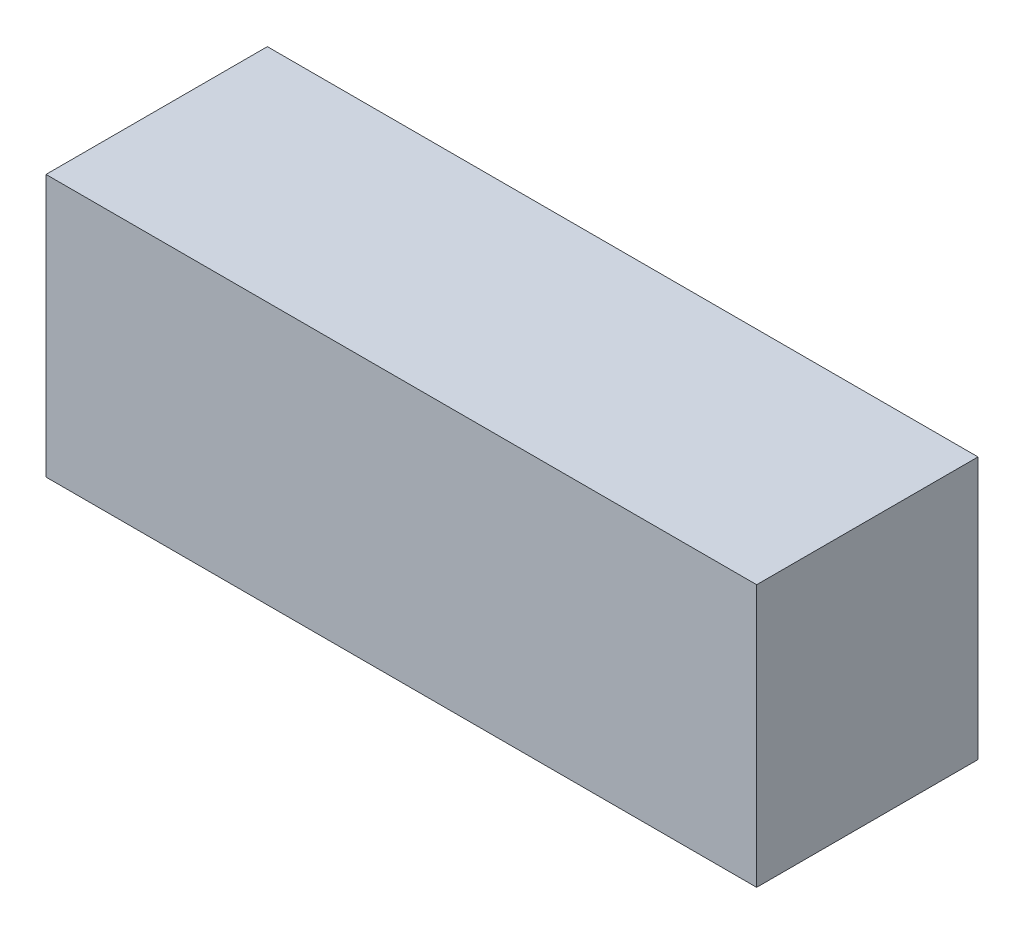
ISO-10303-21;
HEADER;
FILE_DESCRIPTION(('STEP AP214'),'2;1');
FILE_NAME('part.step','',(''),(''),'','','');
FILE_SCHEMA(('AUTOMOTIVE_DESIGN { 1 0 10303 214 1 1 1 1 }'));
ENDSEC;
DATA;
#1=APPLICATION_CONTEXT('core data for automotive mechanical design processes');
#2=APPLICATION_PROTOCOL_DEFINITION('international standard','automotive_design',2000,#1);
#3=PRODUCT_CONTEXT('',#1,'mechanical');
#4=PRODUCT('Part','Part','',(#3));
#5=PRODUCT_RELATED_PRODUCT_CATEGORY('part','',(#4));
#6=PRODUCT_DEFINITION_FORMATION('','',#4);
#7=PRODUCT_DEFINITION_CONTEXT('part definition',#1,'design');
#8=PRODUCT_DEFINITION('design','',#6,#7);
#9=PRODUCT_DEFINITION_SHAPE('','',#8);
#10=(LENGTH_UNIT() NAMED_UNIT(*) SI_UNIT(.MILLI.,.METRE.));
#11=(NAMED_UNIT(*) PLANE_ANGLE_UNIT() SI_UNIT($,.RADIAN.));
#12=(NAMED_UNIT(*) SI_UNIT($,.STERADIAN.) SOLID_ANGLE_UNIT());
#13=UNCERTAINTY_MEASURE_WITH_UNIT(LENGTH_MEASURE(1.E-05),#10,'distance_accuracy_value','');
#14=(GEOMETRIC_REPRESENTATION_CONTEXT(3) GLOBAL_UNCERTAINTY_ASSIGNED_CONTEXT((#13)) GLOBAL_UNIT_ASSIGNED_CONTEXT((#10,
#11,#12)) REPRESENTATION_CONTEXT('',''));
#15=CARTESIAN_POINT('',(0.,0.,0.));
#16=DIRECTION('',(0.,0.,1.));
#17=DIRECTION('',(1.,0.,0.));
#18=AXIS2_PLACEMENT_3D('',#15,#16,#17);
#19=CARTESIAN_POINT('',(-12.7,4.5,-3.8));
#20=DIRECTION('',(1.,0.,0.));
#21=DIRECTION('',(0.,0.,-1.));
#22=AXIS2_PLACEMENT_3D('',#19,#20,#21);
#23=PLANE('',#22);
#24=DIRECTION('',(0.,0.,1.));
#25=VECTOR('',#24,1.);
#26=CARTESIAN_POINT('',(-12.7,0.,-3.8));
#27=LINE('',#26,#25);
#28=CARTESIAN_POINT('',(-12.7,0.,-3.8));
#29=VERTEX_POINT('',#28);
#30=CARTESIAN_POINT('',(-12.7,0.,0.));
#31=VERTEX_POINT('',#30);
#32=EDGE_CURVE('E96',#29,#31,#27,.T.);
#33=ORIENTED_EDGE('',*,*,#32,.T.);
#34=DIRECTION('',(0.,-1.,0.));
#35=VECTOR('',#34,1.);
#36=CARTESIAN_POINT('',(-12.7,4.5,0.));
#37=LINE('',#36,#35);
#38=CARTESIAN_POINT('',(-12.7,4.5,0.));
#39=VERTEX_POINT('',#38);
#40=EDGE_CURVE('E11',#39,#31,#37,.T.);
#41=ORIENTED_EDGE('',*,*,#40,.F.);
#42=DIRECTION('',(0.,0.,1.));
#43=VECTOR('',#42,1.);
#44=CARTESIAN_POINT('',(-12.7,4.5,-3.8));
#45=LINE('',#44,#43);
#46=CARTESIAN_POINT('',(-12.7,4.5,-3.8));
#47=VERTEX_POINT('',#46);
#48=EDGE_CURVE('E84',#47,#39,#45,.T.);
#49=ORIENTED_EDGE('',*,*,#48,.F.);
#50=DIRECTION('',(0.,-1.,0.));
#51=VECTOR('',#50,1.);
#52=CARTESIAN_POINT('',(-12.7,4.5,-3.8));
#53=LINE('',#52,#51);
#54=EDGE_CURVE('E92',#47,#29,#53,.T.);
#55=ORIENTED_EDGE('',*,*,#54,.T.);
#56=EDGE_LOOP('',(#33,#41,#49,#55));
#57=FACE_BOUND('',#56,.T.);
#58=ADVANCED_FACE('F33',(#57),#23,.F.);
#59=CARTESIAN_POINT('',(-12.7,4.5,0.));
#60=DIRECTION('',(0.,0.,-1.));
#61=DIRECTION('',(-1.,0.,0.));
#62=AXIS2_PLACEMENT_3D('',#59,#60,#61);
#63=PLANE('',#62);
#64=DIRECTION('',(1.,0.,0.));
#65=VECTOR('',#64,1.);
#66=CARTESIAN_POINT('',(-12.7,0.,0.));
#67=LINE('',#66,#65);
#68=CARTESIAN_POINT('',(-0.5,0.,0.));
#69=VERTEX_POINT('',#68);
#70=EDGE_CURVE('E88',#31,#69,#67,.T.);
#71=ORIENTED_EDGE('',*,*,#70,.T.);
#72=DIRECTION('',(0.,-1.,0.));
#73=VECTOR('',#72,1.);
#74=CARTESIAN_POINT('',(-0.5,4.5,0.));
#75=LINE('',#74,#73);
#76=CARTESIAN_POINT('',(-0.5,4.5,0.));
#77=VERTEX_POINT('',#76);
#78=EDGE_CURVE('E41',#77,#69,#75,.T.);
#79=ORIENTED_EDGE('',*,*,#78,.F.);
#80=DIRECTION('',(1.,0.,0.));
#81=VECTOR('',#80,1.);
#82=CARTESIAN_POINT('',(-12.7,4.5,0.));
#83=LINE('',#82,#81);
#84=EDGE_CURVE('E79',#39,#77,#83,.T.);
#85=ORIENTED_EDGE('',*,*,#84,.F.);
#86=ORIENTED_EDGE('',*,*,#40,.T.);
#87=EDGE_LOOP('',(#71,#79,#85,#86));
#88=FACE_BOUND('',#87,.T.);
#89=ADVANCED_FACE('F87',(#88),#63,.F.);
#90=CARTESIAN_POINT('',(-0.5,4.5,-3.8));
#91=DIRECTION('',(-1.,0.,0.));
#92=DIRECTION('',(0.,0.,1.));
#93=AXIS2_PLACEMENT_3D('',#90,#91,#92);
#94=PLANE('',#93);
#95=DIRECTION('',(0.,0.,-1.));
#96=VECTOR('',#95,1.);
#97=CARTESIAN_POINT('',(-0.5,0.,-3.8));
#98=LINE('',#97,#96);
#99=CARTESIAN_POINT('',(-0.5,0.,-3.8));
#100=VERTEX_POINT('',#99);
#101=EDGE_CURVE('E66',#69,#100,#98,.T.);
#102=ORIENTED_EDGE('',*,*,#101,.T.);
#103=DIRECTION('',(0.,-1.,0.));
#104=VECTOR('',#103,1.);
#105=CARTESIAN_POINT('',(-0.5,4.5,-3.8));
#106=LINE('',#105,#104);
#107=CARTESIAN_POINT('',(-0.5,4.5,-3.8));
#108=VERTEX_POINT('',#107);
#109=EDGE_CURVE('E89',#108,#100,#106,.T.);
#110=ORIENTED_EDGE('',*,*,#109,.F.);
#111=DIRECTION('',(0.,0.,-1.));
#112=VECTOR('',#111,1.);
#113=CARTESIAN_POINT('',(-0.5,4.5,-3.8));
#114=LINE('',#113,#112);
#115=EDGE_CURVE('E82',#77,#108,#114,.T.);
#116=ORIENTED_EDGE('',*,*,#115,.F.);
#117=ORIENTED_EDGE('',*,*,#78,.T.);
#118=EDGE_LOOP('',(#102,#110,#116,#117));
#119=FACE_BOUND('',#118,.T.);
#120=ADVANCED_FACE('F90',(#119),#94,.F.);
#121=CARTESIAN_POINT('',(-12.7,4.5,-3.8));
#122=DIRECTION('',(0.,0.,1.));
#123=DIRECTION('',(1.,0.,0.));
#124=AXIS2_PLACEMENT_3D('',#121,#122,#123);
#125=PLANE('',#124);
#126=DIRECTION('',(-1.,0.,0.));
#127=VECTOR('',#126,1.);
#128=CARTESIAN_POINT('',(-12.7,0.,-3.8));
#129=LINE('',#128,#127);
#130=EDGE_CURVE('E72',#100,#29,#129,.T.);
#131=ORIENTED_EDGE('',*,*,#130,.T.);
#132=ORIENTED_EDGE('',*,*,#54,.F.);
#133=DIRECTION('',(-1.,0.,0.));
#134=VECTOR('',#133,1.);
#135=CARTESIAN_POINT('',(-12.7,4.5,-3.8));
#136=LINE('',#135,#134);
#137=EDGE_CURVE('E49',#108,#47,#136,.T.);
#138=ORIENTED_EDGE('',*,*,#137,.F.);
#139=ORIENTED_EDGE('',*,*,#109,.T.);
#140=EDGE_LOOP('',(#131,#132,#138,#139));
#141=FACE_BOUND('',#140,.T.);
#142=ADVANCED_FACE('F103',(#141),#125,.F.);
#143=CARTESIAN_POINT('',(0.,4.5,0.));
#144=DIRECTION('',(0.,1.,0.));
#145=DIRECTION('',(0.,0.,1.));
#146=AXIS2_PLACEMENT_3D('',#143,#144,#145);
#147=PLANE('',#146);
#148=ORIENTED_EDGE('',*,*,#48,.T.);
#149=ORIENTED_EDGE('',*,*,#84,.T.);
#150=ORIENTED_EDGE('',*,*,#115,.T.);
#151=ORIENTED_EDGE('',*,*,#137,.T.);
#152=EDGE_LOOP('',(#148,#149,#150,#151));
#153=FACE_BOUND('',#152,.T.);
#154=ADVANCED_FACE('F80',(#153),#147,.T.);
#155=CARTESIAN_POINT('',(0.,0.,0.));
#156=DIRECTION('',(0.,1.,0.));
#157=DIRECTION('',(0.,0.,1.));
#158=AXIS2_PLACEMENT_3D('',#155,#156,#157);
#159=PLANE('',#158);
#160=ORIENTED_EDGE('',*,*,#32,.F.);
#161=ORIENTED_EDGE('',*,*,#130,.F.);
#162=ORIENTED_EDGE('',*,*,#101,.F.);
#163=ORIENTED_EDGE('',*,*,#70,.F.);
#164=EDGE_LOOP('',(#160,#161,#162,#163));
#165=FACE_BOUND('',#164,.T.);
#166=ADVANCED_FACE('F106',(#165),#159,.F.);
#167=CLOSED_SHELL('',(#58,#89,#120,#142,#154,#166));
#168=MANIFOLD_SOLID_BREP('B2',#167);
#169=ADVANCED_BREP_SHAPE_REPRESENTATION('',(#18,#168),#14);
#170=SHAPE_DEFINITION_REPRESENTATION(#9,#169);
ENDSEC;
END-ISO-10303-21;
